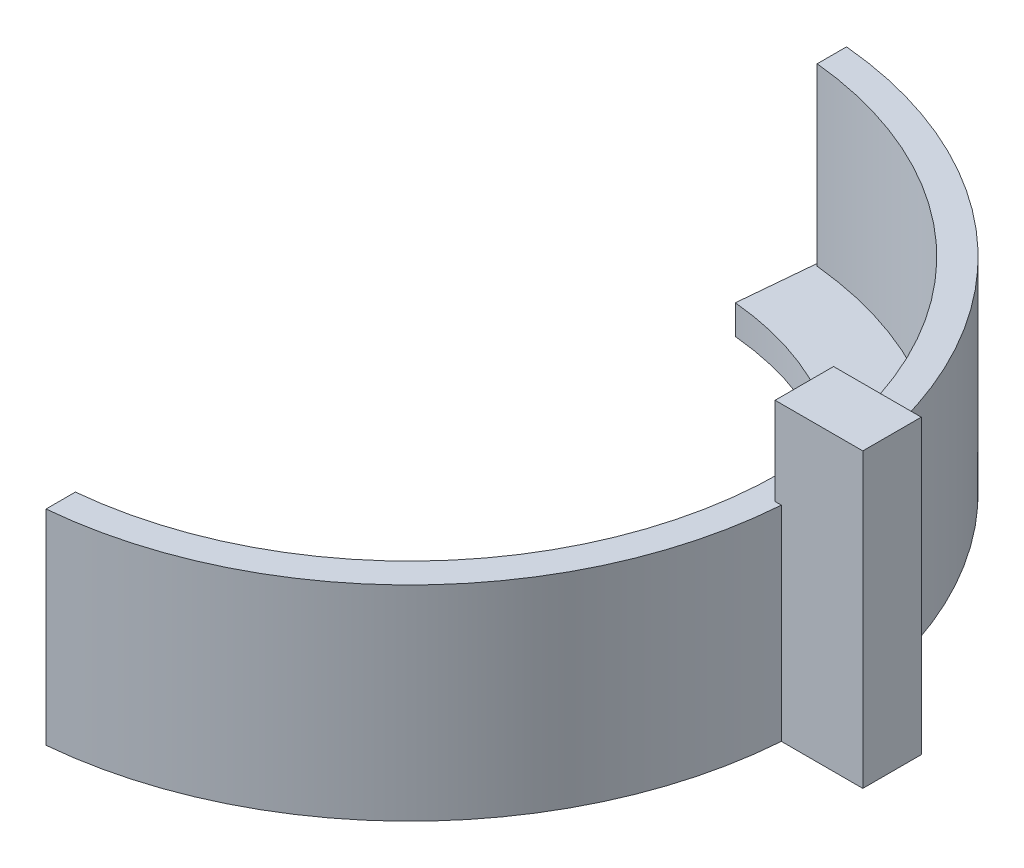
ISO-10303-21;
HEADER;
FILE_DESCRIPTION(('STEP AP214'),'2;1');
FILE_NAME('part.step','',(''),(''),'','','');
FILE_SCHEMA(('AUTOMOTIVE_DESIGN { 1 0 10303 214 1 1 1 1 }'));
ENDSEC;
DATA;
#1=APPLICATION_CONTEXT('core data for automotive mechanical design processes');
#2=APPLICATION_PROTOCOL_DEFINITION('international standard','automotive_design',2000,#1);
#3=PRODUCT_CONTEXT('',#1,'mechanical');
#4=PRODUCT('Part','Part','',(#3));
#5=PRODUCT_RELATED_PRODUCT_CATEGORY('part','',(#4));
#6=PRODUCT_DEFINITION_FORMATION('','',#4);
#7=PRODUCT_DEFINITION_CONTEXT('part definition',#1,'design');
#8=PRODUCT_DEFINITION('design','',#6,#7);
#9=PRODUCT_DEFINITION_SHAPE('','',#8);
#10=(LENGTH_UNIT() NAMED_UNIT(*) SI_UNIT(.MILLI.,.METRE.));
#11=(NAMED_UNIT(*) PLANE_ANGLE_UNIT() SI_UNIT($,.RADIAN.));
#12=(NAMED_UNIT(*) SI_UNIT($,.STERADIAN.) SOLID_ANGLE_UNIT());
#13=UNCERTAINTY_MEASURE_WITH_UNIT(LENGTH_MEASURE(1.E-05),#10,'distance_accuracy_value','');
#14=(GEOMETRIC_REPRESENTATION_CONTEXT(3) GLOBAL_UNCERTAINTY_ASSIGNED_CONTEXT((#13)) GLOBAL_UNIT_ASSIGNED_CONTEXT((#10,
#11,#12)) REPRESENTATION_CONTEXT('',''));
#15=CARTESIAN_POINT('',(0.,0.,0.));
#16=DIRECTION('',(0.,0.,1.));
#17=DIRECTION('',(1.,0.,0.));
#18=AXIS2_PLACEMENT_3D('',#15,#16,#17);
#19=CARTESIAN_POINT('',(0.,12.,0.));
#20=DIRECTION('',(0.,-1.,0.));
#21=DIRECTION('',(0.,0.,-1.));
#22=AXIS2_PLACEMENT_3D('',#19,#20,#21);
#23=CYLINDRICAL_SURFACE('',#22,27.5);
#24=DIRECTION('',(0.,-1.,0.));
#25=VECTOR('',#24,1.);
#26=CARTESIAN_POINT('',(27.427176303805,12.,-2.));
#27=LINE('',#26,#25);
#28=CARTESIAN_POINT('',(27.4271763038049,-2.,-2.));
#29=VERTEX_POINT('',#28);
#30=CARTESIAN_POINT('',(27.427176303805,12.,-2.));
#31=VERTEX_POINT('',#30);
#32=EDGE_CURVE('E154',#29,#31,#27,.F.);
#33=ORIENTED_EDGE('',*,*,#32,.F.);
#34=CARTESIAN_POINT('',(0.,-2.,0.));
#35=DIRECTION('',(0.,1.,0.));
#36=DIRECTION('',(0.,0.,-1.));
#37=AXIS2_PLACEMENT_3D('',#34,#35,#36);
#38=CIRCLE('',#37,27.5);
#39=CARTESIAN_POINT('',(2.5,-2.,-27.3861278752583));
#40=VERTEX_POINT('',#39);
#41=EDGE_CURVE('E147',#29,#40,#38,.T.);
#42=ORIENTED_EDGE('',*,*,#41,.T.);
#43=DIRECTION('',(0.,1.,0.));
#44=VECTOR('',#43,1.);
#45=CARTESIAN_POINT('',(2.5,-2.,-27.3861278752583));
#46=LINE('',#45,#44);
#47=CARTESIAN_POINT('',(2.5,0.,-27.3861278752583));
#48=VERTEX_POINT('',#47);
#49=EDGE_CURVE('E133',#40,#48,#46,.T.);
#50=ORIENTED_EDGE('',*,*,#49,.T.);
#51=DIRECTION('',(0.,-1.,0.));
#52=VECTOR('',#51,1.);
#53=CARTESIAN_POINT('',(2.5,12.,-27.3861278752583));
#54=LINE('',#53,#52);
#55=CARTESIAN_POINT('',(2.5,12.,-27.3861278752583));
#56=VERTEX_POINT('',#55);
#57=EDGE_CURVE('E11',#56,#48,#54,.T.);
#58=ORIENTED_EDGE('',*,*,#57,.F.);
#59=CARTESIAN_POINT('',(0.,12.,0.));
#60=DIRECTION('',(0.,1.,0.));
#61=DIRECTION('',(0.,0.,1.));
#62=AXIS2_PLACEMENT_3D('',#59,#60,#61);
#63=CIRCLE('',#62,27.5);
#64=EDGE_CURVE('E98',#31,#56,#63,.T.);
#65=ORIENTED_EDGE('',*,*,#64,.F.);
#66=EDGE_LOOP('',(#33,#42,#50,#58,#65));
#67=FACE_BOUND('',#66,.T.);
#68=ADVANCED_FACE('F36',(#67),#23,.T.);
#69=DIRECTION('',(0.,-1.,0.));
#70=VECTOR('',#69,1.);
#71=CARTESIAN_POINT('',(27.427176303805,12.,2.));
#72=LINE('',#71,#70);
#73=CARTESIAN_POINT('',(27.427176303805,12.,2.));
#74=VERTEX_POINT('',#73);
#75=CARTESIAN_POINT('',(27.4271763038049,-2.,2.));
#76=VERTEX_POINT('',#75);
#77=EDGE_CURVE('E130',#74,#76,#72,.T.);
#78=ORIENTED_EDGE('',*,*,#77,.F.);
#79=CARTESIAN_POINT('',(2.5,12.,27.3861278752583));
#80=VERTEX_POINT('',#79);
#81=EDGE_CURVE('E101',#80,#74,#63,.T.);
#82=ORIENTED_EDGE('',*,*,#81,.F.);
#83=DIRECTION('',(0.,-1.,0.));
#84=VECTOR('',#83,1.);
#85=CARTESIAN_POINT('',(2.5,12.,27.3861278752583));
#86=LINE('',#85,#84);
#87=CARTESIAN_POINT('',(2.5,0.,27.3861278752583));
#88=VERTEX_POINT('',#87);
#89=EDGE_CURVE('E111',#80,#88,#86,.T.);
#90=ORIENTED_EDGE('',*,*,#89,.T.);
#91=DIRECTION('',(0.,1.,0.));
#92=VECTOR('',#91,1.);
#93=CARTESIAN_POINT('',(2.5,-2.,27.3861278752583));
#94=LINE('',#93,#92);
#95=CARTESIAN_POINT('',(2.5,-2.,27.3861278752583));
#96=VERTEX_POINT('',#95);
#97=EDGE_CURVE('E116',#96,#88,#94,.T.);
#98=ORIENTED_EDGE('',*,*,#97,.F.);
#99=EDGE_CURVE('E163',#96,#76,#38,.T.);
#100=ORIENTED_EDGE('',*,*,#99,.T.);
#101=EDGE_LOOP('',(#78,#82,#90,#98,#100));
#102=FACE_BOUND('',#101,.T.);
#103=ADVANCED_FACE('F126',(#102),#23,.T.);
#104=CARTESIAN_POINT('',(0.,12.,0.));
#105=DIRECTION('',(0.,1.,0.));
#106=DIRECTION('',(0.,0.,1.));
#107=AXIS2_PLACEMENT_3D('',#104,#105,#106);
#108=PLANE('',#107);
#109=DIRECTION('',(0.,0.,-1.));
#110=VECTOR('',#109,1.);
#111=CARTESIAN_POINT('',(27.,12.,0.));
#112=LINE('',#111,#110);
#113=CARTESIAN_POINT('',(27.,12.,2.));
#114=VERTEX_POINT('',#113);
#115=CARTESIAN_POINT('',(27.,12.,-2.));
#116=VERTEX_POINT('',#115);
#117=EDGE_CURVE('E169',#114,#116,#112,.T.);
#118=ORIENTED_EDGE('',*,*,#117,.T.);
#119=DIRECTION('',(1.,0.,0.));
#120=VECTOR('',#119,1.);
#121=CARTESIAN_POINT('',(0.,12.,-2.));
#122=LINE('',#121,#120);
#123=EDGE_CURVE('E167',#116,#31,#122,.T.);
#124=ORIENTED_EDGE('',*,*,#123,.T.);
#125=ORIENTED_EDGE('',*,*,#64,.T.);
#126=DIRECTION('',(0.,0.,1.));
#127=VECTOR('',#126,1.);
#128=CARTESIAN_POINT('',(2.5,12.,-27.3861278752583));
#129=LINE('',#128,#127);
#130=CARTESIAN_POINT('',(2.5,12.,-25.377155080899));
#131=VERTEX_POINT('',#130);
#132=EDGE_CURVE('E89',#56,#131,#129,.T.);
#133=ORIENTED_EDGE('',*,*,#132,.T.);
#134=CARTESIAN_POINT('',(0.,12.,0.));
#135=DIRECTION('',(0.,-1.,0.));
#136=DIRECTION('',(0.,0.,1.));
#137=AXIS2_PLACEMENT_3D('',#134,#135,#136);
#138=CIRCLE('',#137,25.5);
#139=CARTESIAN_POINT('',(2.5,12.,25.377155080899));
#140=VERTEX_POINT('',#139);
#141=EDGE_CURVE('E94',#131,#140,#138,.T.);
#142=ORIENTED_EDGE('',*,*,#141,.T.);
#143=DIRECTION('',(0.,0.,1.));
#144=VECTOR('',#143,1.);
#145=CARTESIAN_POINT('',(2.5,12.,25.377155080899));
#146=LINE('',#145,#144);
#147=EDGE_CURVE('E59',#140,#80,#146,.T.);
#148=ORIENTED_EDGE('',*,*,#147,.T.);
#149=ORIENTED_EDGE('',*,*,#81,.T.);
#150=DIRECTION('',(-1.,0.,0.));
#151=VECTOR('',#150,1.);
#152=CARTESIAN_POINT('',(0.,12.,2.));
#153=LINE('',#152,#151);
#154=EDGE_CURVE('E172',#74,#114,#153,.T.);
#155=ORIENTED_EDGE('',*,*,#154,.T.);
#156=EDGE_LOOP('',(#118,#124,#125,#133,#142,#148,#149,#155));
#157=FACE_BOUND('',#156,.T.);
#158=ADVANCED_FACE('F92',(#157),#108,.T.);
#159=CARTESIAN_POINT('',(2.5,12.,-27.3861278752583));
#160=DIRECTION('',(1.,0.,0.));
#161=DIRECTION('',(0.,0.,-1.));
#162=AXIS2_PLACEMENT_3D('',#159,#160,#161);
#163=PLANE('',#162);
#164=DIRECTION('',(0.,0.,1.));
#165=VECTOR('',#164,1.);
#166=CARTESIAN_POINT('',(2.5,0.,-27.3861278752583));
#167=LINE('',#166,#165);
#168=CARTESIAN_POINT('',(2.5,0.,-25.377155080899));
#169=VERTEX_POINT('',#168);
#170=EDGE_CURVE('E105',#48,#169,#167,.T.);
#171=ORIENTED_EDGE('',*,*,#170,.T.);
#172=DIRECTION('',(0.,-1.,0.));
#173=VECTOR('',#172,1.);
#174=CARTESIAN_POINT('',(2.5,12.,-25.377155080899));
#175=LINE('',#174,#173);
#176=EDGE_CURVE('E43',#131,#169,#175,.T.);
#177=ORIENTED_EDGE('',*,*,#176,.F.);
#178=ORIENTED_EDGE('',*,*,#132,.F.);
#179=ORIENTED_EDGE('',*,*,#57,.T.);
#180=EDGE_LOOP('',(#171,#177,#178,#179));
#181=FACE_BOUND('',#180,.T.);
#182=ADVANCED_FACE('F104',(#181),#163,.F.);
#183=CARTESIAN_POINT('',(0.,12.,0.));
#184=DIRECTION('',(0.,-1.,0.));
#185=DIRECTION('',(0.,0.,-1.));
#186=AXIS2_PLACEMENT_3D('',#183,#184,#185);
#187=CYLINDRICAL_SURFACE('',#186,25.5);
#188=CARTESIAN_POINT('',(0.,0.,0.));
#189=DIRECTION('',(0.,-1.,0.));
#190=DIRECTION('',(0.,0.,1.));
#191=AXIS2_PLACEMENT_3D('',#188,#189,#190);
#192=CIRCLE('',#191,25.5);
#193=CARTESIAN_POINT('',(2.5,0.,25.377155080899));
#194=VERTEX_POINT('',#193);
#195=EDGE_CURVE('E72',#169,#194,#192,.T.);
#196=ORIENTED_EDGE('',*,*,#195,.T.);
#197=DIRECTION('',(0.,-1.,0.));
#198=VECTOR('',#197,1.);
#199=CARTESIAN_POINT('',(2.5,12.,25.377155080899));
#200=LINE('',#199,#198);
#201=EDGE_CURVE('E107',#140,#194,#200,.T.);
#202=ORIENTED_EDGE('',*,*,#201,.F.);
#203=ORIENTED_EDGE('',*,*,#141,.F.);
#204=ORIENTED_EDGE('',*,*,#176,.T.);
#205=EDGE_LOOP('',(#196,#202,#203,#204));
#206=FACE_BOUND('',#205,.T.);
#207=ADVANCED_FACE('F108',(#206),#187,.F.);
#208=CARTESIAN_POINT('',(2.5,12.,25.377155080899));
#209=DIRECTION('',(1.,0.,0.));
#210=DIRECTION('',(0.,0.,-1.));
#211=AXIS2_PLACEMENT_3D('',#208,#209,#210);
#212=PLANE('',#211);
#213=DIRECTION('',(0.,0.,1.));
#214=VECTOR('',#213,1.);
#215=CARTESIAN_POINT('',(2.5,0.,25.377155080899));
#216=LINE('',#215,#214);
#217=EDGE_CURVE('E80',#194,#88,#216,.T.);
#218=ORIENTED_EDGE('',*,*,#217,.T.);
#219=ORIENTED_EDGE('',*,*,#89,.F.);
#220=ORIENTED_EDGE('',*,*,#147,.F.);
#221=ORIENTED_EDGE('',*,*,#201,.T.);
#222=EDGE_LOOP('',(#218,#219,#220,#221));
#223=FACE_BOUND('',#222,.T.);
#224=ADVANCED_FACE('F122',(#223),#212,.F.);
#225=CARTESIAN_POINT('',(2.5,-2.,27.3861278752583));
#226=DIRECTION('',(-0.995859195463938,0.,0.0909090909090934));
#227=DIRECTION('',(0.0909090909090934,0.,0.995859195463938));
#228=AXIS2_PLACEMENT_3D('',#225,#226,#227);
#229=PLANE('',#228);
#230=DIRECTION('',(0.0909090909090934,0.,0.995859195463938));
#231=VECTOR('',#230,1.);
#232=CARTESIAN_POINT('',(2.5,0.,27.3861278752583));
#233=LINE('',#232,#231);
#234=CARTESIAN_POINT('',(1.86363636363634,0.,20.4151135070107));
#235=VERTEX_POINT('',#234);
#236=EDGE_CURVE('E145',#235,#88,#233,.T.);
#237=ORIENTED_EDGE('',*,*,#236,.F.);
#238=DIRECTION('',(0.,1.,0.));
#239=VECTOR('',#238,1.);
#240=CARTESIAN_POINT('',(1.86363636363634,-2.,20.4151135070107));
#241=LINE('',#240,#239);
#242=CARTESIAN_POINT('',(1.86363636363634,-2.,20.4151135070107));
#243=VERTEX_POINT('',#242);
#244=EDGE_CURVE('E140',#243,#235,#241,.T.);
#245=ORIENTED_EDGE('',*,*,#244,.F.);
#246=DIRECTION('',(0.0909090909090934,0.,0.995859195463938));
#247=VECTOR('',#246,1.);
#248=CARTESIAN_POINT('',(2.5,-2.,27.3861278752583));
#249=LINE('',#248,#247);
#250=EDGE_CURVE('E137',#243,#96,#249,.T.);
#251=ORIENTED_EDGE('',*,*,#250,.T.);
#252=ORIENTED_EDGE('',*,*,#97,.T.);
#253=EDGE_LOOP('',(#237,#245,#251,#252));
#254=FACE_BOUND('',#253,.T.);
#255=ADVANCED_FACE('F257',(#254),#229,.T.);
#256=CARTESIAN_POINT('',(0.,-2.,0.));
#257=DIRECTION('',(0.,1.,0.));
#258=DIRECTION('',(0.,0.,1.));
#259=AXIS2_PLACEMENT_3D('',#256,#257,#258);
#260=CYLINDRICAL_SURFACE('',#259,20.5);
#261=CARTESIAN_POINT('',(0.,0.,0.));
#262=DIRECTION('',(0.,-1.,0.));
#263=DIRECTION('',(0.,0.,-1.));
#264=AXIS2_PLACEMENT_3D('',#261,#262,#263);
#265=CIRCLE('',#264,20.5);
#266=CARTESIAN_POINT('',(1.86363636363636,0.,-20.4151135070107));
#267=VERTEX_POINT('',#266);
#268=EDGE_CURVE('E148',#267,#235,#265,.T.);
#269=ORIENTED_EDGE('',*,*,#268,.F.);
#270=DIRECTION('',(0.,1.,0.));
#271=VECTOR('',#270,1.);
#272=CARTESIAN_POINT('',(1.86363636363636,-2.,-20.4151135070107));
#273=LINE('',#272,#271);
#274=CARTESIAN_POINT('',(1.86363636363636,-2.,-20.4151135070107));
#275=VERTEX_POINT('',#274);
#276=EDGE_CURVE('E136',#275,#267,#273,.T.);
#277=ORIENTED_EDGE('',*,*,#276,.F.);
#278=CARTESIAN_POINT('',(0.,-2.,0.));
#279=DIRECTION('',(0.,-1.,0.));
#280=DIRECTION('',(0.,0.,-1.));
#281=AXIS2_PLACEMENT_3D('',#278,#279,#280);
#282=CIRCLE('',#281,20.5);
#283=EDGE_CURVE('E157',#275,#243,#282,.T.);
#284=ORIENTED_EDGE('',*,*,#283,.T.);
#285=ORIENTED_EDGE('',*,*,#244,.T.);
#286=EDGE_LOOP('',(#269,#277,#284,#285));
#287=FACE_BOUND('',#286,.T.);
#288=ADVANCED_FACE('F262',(#287),#260,.F.);
#289=CARTESIAN_POINT('',(2.5,-2.,-27.3861278752583));
#290=DIRECTION('',(-0.995859195463938,0.,-0.0909090909090919));
#291=DIRECTION('',(-0.0909090909090919,0.,0.995859195463938));
#292=AXIS2_PLACEMENT_3D('',#289,#290,#291);
#293=PLANE('',#292);
#294=DIRECTION('',(-0.0909090909090919,0.,0.995859195463938));
#295=VECTOR('',#294,1.);
#296=CARTESIAN_POINT('',(2.5,0.,-27.3861278752583));
#297=LINE('',#296,#295);
#298=EDGE_CURVE('E151',#48,#267,#297,.T.);
#299=ORIENTED_EDGE('',*,*,#298,.F.);
#300=ORIENTED_EDGE('',*,*,#49,.F.);
#301=DIRECTION('',(-0.0909090909090919,0.,0.995859195463938));
#302=VECTOR('',#301,1.);
#303=CARTESIAN_POINT('',(2.5,-2.,-27.3861278752583));
#304=LINE('',#303,#302);
#305=EDGE_CURVE('E160',#40,#275,#304,.T.);
#306=ORIENTED_EDGE('',*,*,#305,.T.);
#307=ORIENTED_EDGE('',*,*,#276,.T.);
#308=EDGE_LOOP('',(#299,#300,#306,#307));
#309=FACE_BOUND('',#308,.T.);
#310=ADVANCED_FACE('F268',(#309),#293,.T.);
#311=CARTESIAN_POINT('',(0.,-2.,0.));
#312=DIRECTION('',(0.,-1.,0.));
#313=DIRECTION('',(0.,0.,-1.));
#314=AXIS2_PLACEMENT_3D('',#311,#312,#313);
#315=PLANE('',#314);
#316=ORIENTED_EDGE('',*,*,#41,.F.);
#317=DIRECTION('',(-1.,0.,0.));
#318=VECTOR('',#317,1.);
#319=CARTESIAN_POINT('',(27.,-2.,-2.));
#320=LINE('',#319,#318);
#321=CARTESIAN_POINT('',(33.,-2.,-2.));
#322=VERTEX_POINT('',#321);
#323=EDGE_CURVE('E189',#322,#29,#320,.T.);
#324=ORIENTED_EDGE('',*,*,#323,.F.);
#325=DIRECTION('',(0.,0.,-1.));
#326=VECTOR('',#325,1.);
#327=CARTESIAN_POINT('',(33.,-2.,-2.));
#328=LINE('',#327,#326);
#329=CARTESIAN_POINT('',(33.,-2.,2.));
#330=VERTEX_POINT('',#329);
#331=EDGE_CURVE('E192',#330,#322,#328,.T.);
#332=ORIENTED_EDGE('',*,*,#331,.F.);
#333=DIRECTION('',(1.,0.,0.));
#334=VECTOR('',#333,1.);
#335=CARTESIAN_POINT('',(27.,-2.,2.));
#336=LINE('',#335,#334);
#337=EDGE_CURVE('E185',#76,#330,#336,.T.);
#338=ORIENTED_EDGE('',*,*,#337,.F.);
#339=ORIENTED_EDGE('',*,*,#99,.F.);
#340=ORIENTED_EDGE('',*,*,#250,.F.);
#341=ORIENTED_EDGE('',*,*,#283,.F.);
#342=ORIENTED_EDGE('',*,*,#305,.F.);
#343=EDGE_LOOP('',(#316,#324,#332,#338,#339,#340,#341,#342));
#344=FACE_BOUND('',#343,.T.);
#345=ADVANCED_FACE('F266',(#344),#315,.T.);
#346=CARTESIAN_POINT('',(0.,0.,0.));
#347=DIRECTION('',(0.,-1.,0.));
#348=DIRECTION('',(0.,0.,-1.));
#349=AXIS2_PLACEMENT_3D('',#346,#347,#348);
#350=PLANE('',#349);
#351=ORIENTED_EDGE('',*,*,#217,.F.);
#352=ORIENTED_EDGE('',*,*,#195,.F.);
#353=ORIENTED_EDGE('',*,*,#170,.F.);
#354=ORIENTED_EDGE('',*,*,#298,.T.);
#355=ORIENTED_EDGE('',*,*,#268,.T.);
#356=ORIENTED_EDGE('',*,*,#236,.T.);
#357=EDGE_LOOP('',(#351,#352,#353,#354,#355,#356));
#358=FACE_BOUND('',#357,.T.);
#359=ADVANCED_FACE('F260',(#358),#350,.F.);
#360=CARTESIAN_POINT('',(27.,18.,-2.));
#361=DIRECTION('',(0.,0.,1.));
#362=DIRECTION('',(1.,0.,0.));
#363=AXIS2_PLACEMENT_3D('',#360,#361,#362);
#364=PLANE('',#363);
#365=ORIENTED_EDGE('',*,*,#323,.T.);
#366=ORIENTED_EDGE('',*,*,#32,.T.);
#367=ORIENTED_EDGE('',*,*,#123,.F.);
#368=DIRECTION('',(0.,-1.,0.));
#369=VECTOR('',#368,1.);
#370=CARTESIAN_POINT('',(27.,18.,-2.));
#371=LINE('',#370,#369);
#372=CARTESIAN_POINT('',(27.,18.,-2.));
#373=VERTEX_POINT('',#372);
#374=EDGE_CURVE('E177',#373,#116,#371,.T.);
#375=ORIENTED_EDGE('',*,*,#374,.F.);
#376=DIRECTION('',(-1.,0.,0.));
#377=VECTOR('',#376,1.);
#378=CARTESIAN_POINT('',(27.,18.,-2.));
#379=LINE('',#378,#377);
#380=CARTESIAN_POINT('',(33.,18.,-2.));
#381=VERTEX_POINT('',#380);
#382=EDGE_CURVE('E200',#381,#373,#379,.T.);
#383=ORIENTED_EDGE('',*,*,#382,.F.);
#384=DIRECTION('',(0.,-1.,0.));
#385=VECTOR('',#384,1.);
#386=CARTESIAN_POINT('',(33.,18.,-2.));
#387=LINE('',#386,#385);
#388=EDGE_CURVE('E174',#381,#322,#387,.T.);
#389=ORIENTED_EDGE('',*,*,#388,.T.);
#390=EDGE_LOOP('',(#365,#366,#367,#375,#383,#389));
#391=FACE_BOUND('',#390,.T.);
#392=ADVANCED_FACE('F221',(#391),#364,.F.);
#393=CARTESIAN_POINT('',(27.,18.,2.));
#394=DIRECTION('',(0.,0.,-1.));
#395=DIRECTION('',(-1.,0.,0.));
#396=AXIS2_PLACEMENT_3D('',#393,#394,#395);
#397=PLANE('',#396);
#398=ORIENTED_EDGE('',*,*,#154,.F.);
#399=ORIENTED_EDGE('',*,*,#77,.T.);
#400=ORIENTED_EDGE('',*,*,#337,.T.);
#401=DIRECTION('',(0.,-1.,0.));
#402=VECTOR('',#401,1.);
#403=CARTESIAN_POINT('',(33.,18.,2.));
#404=LINE('',#403,#402);
#405=CARTESIAN_POINT('',(33.,18.,2.));
#406=VERTEX_POINT('',#405);
#407=EDGE_CURVE('E181',#406,#330,#404,.T.);
#408=ORIENTED_EDGE('',*,*,#407,.F.);
#409=DIRECTION('',(1.,0.,0.));
#410=VECTOR('',#409,1.);
#411=CARTESIAN_POINT('',(27.,18.,2.));
#412=LINE('',#411,#410);
#413=CARTESIAN_POINT('',(27.,18.,2.));
#414=VERTEX_POINT('',#413);
#415=EDGE_CURVE('E184',#414,#406,#412,.T.);
#416=ORIENTED_EDGE('',*,*,#415,.F.);
#417=DIRECTION('',(0.,-1.,0.));
#418=VECTOR('',#417,1.);
#419=CARTESIAN_POINT('',(27.,18.,2.));
#420=LINE('',#419,#418);
#421=EDGE_CURVE('E50',#414,#114,#420,.T.);
#422=ORIENTED_EDGE('',*,*,#421,.T.);
#423=EDGE_LOOP('',(#398,#399,#400,#408,#416,#422));
#424=FACE_BOUND('',#423,.T.);
#425=ADVANCED_FACE('F275',(#424),#397,.F.);
#426=CARTESIAN_POINT('',(33.,18.,-2.));
#427=DIRECTION('',(-1.,0.,0.));
#428=DIRECTION('',(0.,0.,1.));
#429=AXIS2_PLACEMENT_3D('',#426,#427,#428);
#430=PLANE('',#429);
#431=ORIENTED_EDGE('',*,*,#331,.T.);
#432=ORIENTED_EDGE('',*,*,#388,.F.);
#433=DIRECTION('',(0.,0.,-1.));
#434=VECTOR('',#433,1.);
#435=CARTESIAN_POINT('',(33.,18.,-2.));
#436=LINE('',#435,#434);
#437=EDGE_CURVE('E188',#406,#381,#436,.T.);
#438=ORIENTED_EDGE('',*,*,#437,.F.);
#439=ORIENTED_EDGE('',*,*,#407,.T.);
#440=EDGE_LOOP('',(#431,#432,#438,#439));
#441=FACE_BOUND('',#440,.T.);
#442=ADVANCED_FACE('F217',(#441),#430,.F.);
#443=CARTESIAN_POINT('',(27.,18.,-2.));
#444=DIRECTION('',(1.,0.,0.));
#445=DIRECTION('',(0.,0.,-1.));
#446=AXIS2_PLACEMENT_3D('',#443,#444,#445);
#447=PLANE('',#446);
#448=ORIENTED_EDGE('',*,*,#117,.F.);
#449=ORIENTED_EDGE('',*,*,#421,.F.);
#450=DIRECTION('',(0.,0.,1.));
#451=VECTOR('',#450,1.);
#452=CARTESIAN_POINT('',(27.,18.,-2.));
#453=LINE('',#452,#451);
#454=EDGE_CURVE('E197',#373,#414,#453,.T.);
#455=ORIENTED_EDGE('',*,*,#454,.F.);
#456=ORIENTED_EDGE('',*,*,#374,.T.);
#457=EDGE_LOOP('',(#448,#449,#455,#456));
#458=FACE_BOUND('',#457,.T.);
#459=ADVANCED_FACE('F271',(#458),#447,.F.);
#460=CARTESIAN_POINT('',(0.,18.,0.));
#461=DIRECTION('',(0.,1.,0.));
#462=DIRECTION('',(0.,0.,1.));
#463=AXIS2_PLACEMENT_3D('',#460,#461,#462);
#464=PLANE('',#463);
#465=ORIENTED_EDGE('',*,*,#437,.T.);
#466=ORIENTED_EDGE('',*,*,#382,.T.);
#467=ORIENTED_EDGE('',*,*,#454,.T.);
#468=ORIENTED_EDGE('',*,*,#415,.T.);
#469=EDGE_LOOP('',(#465,#466,#467,#468));
#470=FACE_BOUND('',#469,.T.);
#471=ADVANCED_FACE('F208',(#470),#464,.T.);
#472=CLOSED_SHELL('',(#68,#103,#158,#182,#207,#224,#255,#288,#310,#345,#359,#392,#425,#442,#459,#471));
#473=MANIFOLD_SOLID_BREP('B2',#472);
#474=ADVANCED_BREP_SHAPE_REPRESENTATION('',(#18,#473),#14);
#475=SHAPE_DEFINITION_REPRESENTATION(#9,#474);
ENDSEC;
END-ISO-10303-21;
